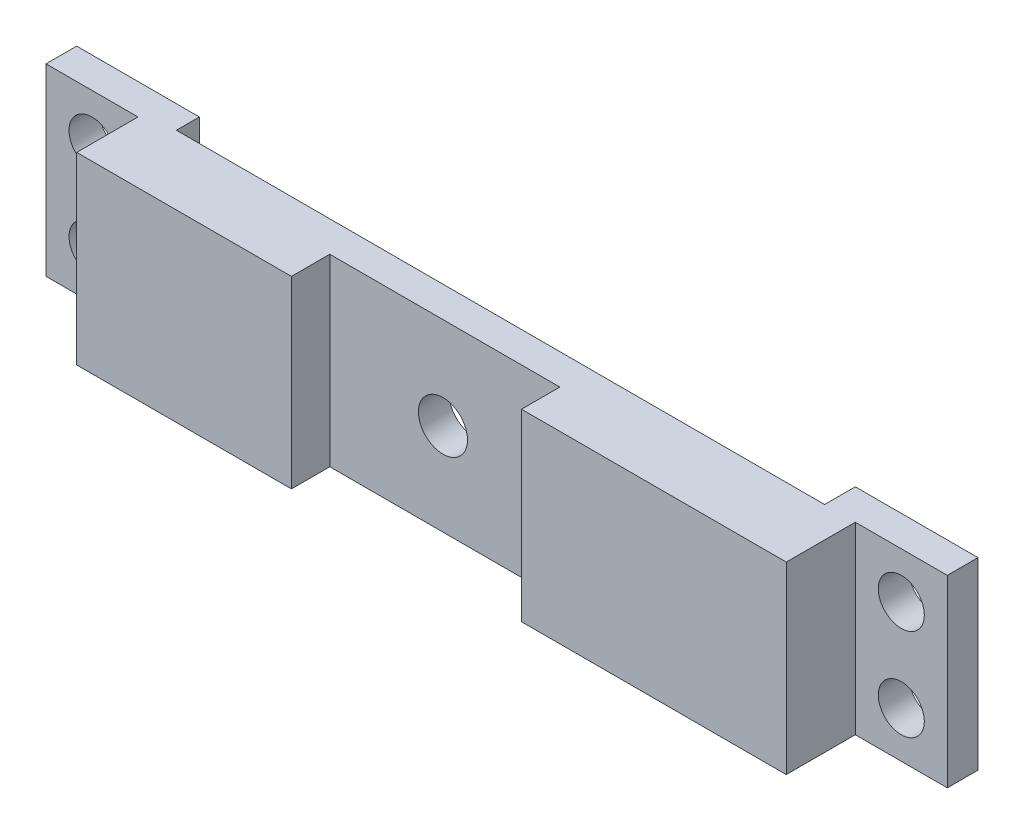
ISO-10303-21;
HEADER;
FILE_DESCRIPTION(('STEP AP214'),'2;1');
FILE_NAME('part.step','',(''),(''),'','','');
FILE_SCHEMA(('AUTOMOTIVE_DESIGN { 1 0 10303 214 1 1 1 1 }'));
ENDSEC;
DATA;
#1=APPLICATION_CONTEXT('core data for automotive mechanical design processes');
#2=APPLICATION_PROTOCOL_DEFINITION('international standard','automotive_design',2000,#1);
#3=PRODUCT_CONTEXT('',#1,'mechanical');
#4=PRODUCT('Part','Part','',(#3));
#5=PRODUCT_RELATED_PRODUCT_CATEGORY('part','',(#4));
#6=PRODUCT_DEFINITION_FORMATION('','',#4);
#7=PRODUCT_DEFINITION_CONTEXT('part definition',#1,'design');
#8=PRODUCT_DEFINITION('design','',#6,#7);
#9=PRODUCT_DEFINITION_SHAPE('','',#8);
#10=(LENGTH_UNIT() NAMED_UNIT(*) SI_UNIT(.MILLI.,.METRE.));
#11=(NAMED_UNIT(*) PLANE_ANGLE_UNIT() SI_UNIT($,.RADIAN.));
#12=(NAMED_UNIT(*) SI_UNIT($,.STERADIAN.) SOLID_ANGLE_UNIT());
#13=UNCERTAINTY_MEASURE_WITH_UNIT(LENGTH_MEASURE(1.E-05),#10,'distance_accuracy_value','');
#14=(GEOMETRIC_REPRESENTATION_CONTEXT(3) GLOBAL_UNCERTAINTY_ASSIGNED_CONTEXT((#13)) GLOBAL_UNIT_ASSIGNED_CONTEXT((#10,
#11,#12)) REPRESENTATION_CONTEXT('',''));
#15=CARTESIAN_POINT('',(0.,0.,0.));
#16=DIRECTION('',(0.,0.,1.));
#17=DIRECTION('',(1.,0.,0.));
#18=AXIS2_PLACEMENT_3D('',#15,#16,#17);
#19=CARTESIAN_POINT('',(9.88,0.,-4.52548339959391));
#20=DIRECTION('',(0.,0.,1.));
#21=DIRECTION('',(1.,0.,0.));
#22=AXIS2_PLACEMENT_3D('',#19,#20,#21);
#23=CYLINDRICAL_SURFACE('',#22,1.6);
#24=CARTESIAN_POINT('',(9.88,0.,3.5));
#25=DIRECTION('',(0.,0.,-1.));
#26=DIRECTION('',(-1.,0.,0.));
#27=AXIS2_PLACEMENT_3D('',#24,#25,#26);
#28=CIRCLE('',#27,1.6);
#29=CARTESIAN_POINT('',(8.27999999999999,0.,3.5));
#30=VERTEX_POINT('',#29);
#31=EDGE_CURVE('E322',#30,#30,#28,.F.);
#32=ORIENTED_EDGE('',*,*,#31,.T.);
#33=EDGE_LOOP('',(#32));
#34=FACE_BOUND('',#33,.T.);
#35=CARTESIAN_POINT('',(9.88,0.,1.5));
#36=DIRECTION('',(0.,0.,-1.));
#37=DIRECTION('',(-1.,0.,0.));
#38=AXIS2_PLACEMENT_3D('',#35,#36,#37);
#39=CIRCLE('',#38,1.6);
#40=CARTESIAN_POINT('',(8.27999999999999,0.,1.5));
#41=VERTEX_POINT('',#40);
#42=EDGE_CURVE('E184',#41,#41,#39,.F.);
#43=ORIENTED_EDGE('',*,*,#42,.F.);
#44=EDGE_LOOP('',(#43));
#45=FACE_BOUND('',#44,.T.);
#46=ADVANCED_FACE('F32',(#34,#45),#23,.F.);
#47=CARTESIAN_POINT('',(-17.5,6.,6.));
#48=DIRECTION('',(1.,0.,0.));
#49=DIRECTION('',(0.,1.,0.));
#50=AXIS2_PLACEMENT_3D('',#47,#48,#49);
#51=PLANE('',#50);
#52=DIRECTION('',(0.,-1.,0.));
#53=VECTOR('',#52,1.);
#54=CARTESIAN_POINT('',(-17.5,6.,2.));
#55=LINE('',#54,#53);
#56=CARTESIAN_POINT('',(-17.5,6.,2.));
#57=VERTEX_POINT('',#56);
#58=CARTESIAN_POINT('',(-17.5,-6.,2.));
#59=VERTEX_POINT('',#58);
#60=EDGE_CURVE('E341',#57,#59,#55,.T.);
#61=ORIENTED_EDGE('',*,*,#60,.F.);
#62=DIRECTION('',(0.,0.,-1.));
#63=VECTOR('',#62,1.);
#64=CARTESIAN_POINT('',(-17.5,6.,6.));
#65=LINE('',#64,#63);
#66=CARTESIAN_POINT('',(-17.5,6.,0.));
#67=VERTEX_POINT('',#66);
#68=EDGE_CURVE('E41',#57,#67,#65,.T.);
#69=ORIENTED_EDGE('',*,*,#68,.T.);
#70=DIRECTION('',(0.,-1.,0.));
#71=VECTOR('',#70,1.);
#72=CARTESIAN_POINT('',(-17.5,6.,0.));
#73=LINE('',#72,#71);
#74=CARTESIAN_POINT('',(-17.5,-6.,0.));
#75=VERTEX_POINT('',#74);
#76=EDGE_CURVE('E317',#67,#75,#73,.T.);
#77=ORIENTED_EDGE('',*,*,#76,.T.);
#78=DIRECTION('',(0.,0.,-1.));
#79=VECTOR('',#78,1.);
#80=CARTESIAN_POINT('',(-17.5,-6.,6.));
#81=LINE('',#80,#79);
#82=EDGE_CURVE('E11',#59,#75,#81,.T.);
#83=ORIENTED_EDGE('',*,*,#82,.F.);
#84=EDGE_LOOP('',(#61,#69,#77,#83));
#85=FACE_BOUND('',#84,.T.);
#86=ADVANCED_FACE('F34',(#85),#51,.F.);
#87=CARTESIAN_POINT('',(-17.5,-6.,6.));
#88=DIRECTION('',(0.,1.,0.));
#89=DIRECTION('',(0.,0.,1.));
#90=AXIS2_PLACEMENT_3D('',#87,#88,#89);
#91=PLANE('',#90);
#92=DIRECTION('',(1.,0.,0.));
#93=VECTOR('',#92,1.);
#94=CARTESIAN_POINT('',(-17.5,-6.,0.));
#95=LINE('',#94,#93);
#96=CARTESIAN_POINT('',(-9.5,-6.,0.));
#97=VERTEX_POINT('',#96);
#98=EDGE_CURVE('E320',#75,#97,#95,.T.);
#99=ORIENTED_EDGE('',*,*,#98,.T.);
#100=DIRECTION('',(0.,0.,-1.));
#101=VECTOR('',#100,1.);
#102=CARTESIAN_POINT('',(-9.5,-6.,1.5));
#103=LINE('',#102,#101);
#104=CARTESIAN_POINT('',(-9.5,-6.,1.5));
#105=VERTEX_POINT('',#104);
#106=EDGE_CURVE('E49',#105,#97,#103,.T.);
#107=ORIENTED_EDGE('',*,*,#106,.F.);
#108=DIRECTION('',(-1.,0.,0.));
#109=VECTOR('',#108,1.);
#110=CARTESIAN_POINT('',(17.5,-6.,1.5));
#111=LINE('',#110,#109);
#112=CARTESIAN_POINT('',(32.76,-6.,1.5));
#113=VERTEX_POINT('',#112);
#114=EDGE_CURVE('E177',#113,#105,#111,.T.);
#115=ORIENTED_EDGE('',*,*,#114,.F.);
#116=DIRECTION('',(0.,0.,-1.));
#117=VECTOR('',#116,1.);
#118=CARTESIAN_POINT('',(32.76,-6.,1.5));
#119=LINE('',#118,#117);
#120=CARTESIAN_POINT('',(32.76,-6.,-0.5));
#121=VERTEX_POINT('',#120);
#122=EDGE_CURVE('E153',#113,#121,#119,.T.);
#123=ORIENTED_EDGE('',*,*,#122,.T.);
#124=DIRECTION('',(1.,0.,0.));
#125=VECTOR('',#124,1.);
#126=CARTESIAN_POINT('',(32.76,-6.,-0.5));
#127=LINE('',#126,#125);
#128=CARTESIAN_POINT('',(40.76,-6.,-0.5));
#129=VERTEX_POINT('',#128);
#130=EDGE_CURVE('E269',#121,#129,#127,.T.);
#131=ORIENTED_EDGE('',*,*,#130,.T.);
#132=DIRECTION('',(0.,0.,1.));
#133=VECTOR('',#132,1.);
#134=CARTESIAN_POINT('',(40.76,-6.,1.5));
#135=LINE('',#134,#133);
#136=CARTESIAN_POINT('',(40.76,-6.,1.5));
#137=VERTEX_POINT('',#136);
#138=EDGE_CURVE('E263',#129,#137,#135,.T.);
#139=ORIENTED_EDGE('',*,*,#138,.T.);
#140=DIRECTION('',(-1.,0.,0.));
#141=VECTOR('',#140,1.);
#142=CARTESIAN_POINT('',(32.76,-6.,1.5));
#143=LINE('',#142,#141);
#144=CARTESIAN_POINT('',(34.76,-6.,1.5));
#145=VERTEX_POINT('',#144);
#146=EDGE_CURVE('E229',#137,#145,#143,.T.);
#147=ORIENTED_EDGE('',*,*,#146,.T.);
#148=DIRECTION('',(0.,0.,-1.));
#149=VECTOR('',#148,1.);
#150=CARTESIAN_POINT('',(34.76,-6.00000000000001,6.));
#151=LINE('',#150,#149);
#152=CARTESIAN_POINT('',(34.76,-6.00000000000001,6.));
#153=VERTEX_POINT('',#152);
#154=EDGE_CURVE('E249',#153,#145,#151,.T.);
#155=ORIENTED_EDGE('',*,*,#154,.F.);
#156=DIRECTION('',(-1.,0.,0.));
#157=VECTOR('',#156,1.);
#158=CARTESIAN_POINT('',(34.76,-6.00000000000001,6.));
#159=LINE('',#158,#157);
#160=CARTESIAN_POINT('',(17.5,-6.,6.));
#161=VERTEX_POINT('',#160);
#162=EDGE_CURVE('E183',#153,#161,#159,.T.);
#163=ORIENTED_EDGE('',*,*,#162,.T.);
#164=DIRECTION('',(0.,0.,-1.));
#165=VECTOR('',#164,1.);
#166=CARTESIAN_POINT('',(17.5,-6.,6.));
#167=LINE('',#166,#165);
#168=CARTESIAN_POINT('',(17.5,-6.,3.5));
#169=VERTEX_POINT('',#168);
#170=EDGE_CURVE('E219',#161,#169,#167,.T.);
#171=ORIENTED_EDGE('',*,*,#170,.T.);
#172=DIRECTION('',(1.,0.,0.));
#173=VECTOR('',#172,1.);
#174=CARTESIAN_POINT('',(17.5,-6.,3.5));
#175=LINE('',#174,#173);
#176=CARTESIAN_POINT('',(2.5,-6.,3.5));
#177=VERTEX_POINT('',#176);
#178=EDGE_CURVE('E201',#177,#169,#175,.T.);
#179=ORIENTED_EDGE('',*,*,#178,.F.);
#180=DIRECTION('',(0.,0.,1.));
#181=VECTOR('',#180,1.);
#182=CARTESIAN_POINT('',(2.5,-6.,3.5));
#183=LINE('',#182,#181);
#184=CARTESIAN_POINT('',(2.5,-6.,6.));
#185=VERTEX_POINT('',#184);
#186=EDGE_CURVE('E206',#177,#185,#183,.T.);
#187=ORIENTED_EDGE('',*,*,#186,.T.);
#188=DIRECTION('',(1.,0.,0.));
#189=VECTOR('',#188,1.);
#190=CARTESIAN_POINT('',(-17.5,-6.,6.));
#191=LINE('',#190,#189);
#192=CARTESIAN_POINT('',(-11.5,-6.,6.));
#193=VERTEX_POINT('',#192);
#194=EDGE_CURVE('E309',#193,#185,#191,.T.);
#195=ORIENTED_EDGE('',*,*,#194,.F.);
#196=DIRECTION('',(0.,0.,1.));
#197=VECTOR('',#196,1.);
#198=CARTESIAN_POINT('',(-11.5,-6.,2.));
#199=LINE('',#198,#197);
#200=CARTESIAN_POINT('',(-11.5,-6.,2.));
#201=VERTEX_POINT('',#200);
#202=EDGE_CURVE('E351',#201,#193,#199,.T.);
#203=ORIENTED_EDGE('',*,*,#202,.F.);
#204=DIRECTION('',(1.,0.,0.));
#205=VECTOR('',#204,1.);
#206=CARTESIAN_POINT('',(-17.5,-6.,2.));
#207=LINE('',#206,#205);
#208=EDGE_CURVE('E343',#59,#201,#207,.T.);
#209=ORIENTED_EDGE('',*,*,#208,.F.);
#210=ORIENTED_EDGE('',*,*,#82,.T.);
#211=EDGE_LOOP('',(#99,#107,#115,#123,#131,#139,#147,#155,#163,#171,#179,#187,#195,#203,#209,#210));
#212=FACE_BOUND('',#211,.T.);
#213=ADVANCED_FACE('F215',(#212),#91,.F.);
#214=CARTESIAN_POINT('',(-17.5,6.,6.));
#215=DIRECTION('',(0.,-1.,0.));
#216=DIRECTION('',(0.,0.,-1.));
#217=AXIS2_PLACEMENT_3D('',#214,#215,#216);
#218=PLANE('',#217);
#219=DIRECTION('',(1.,0.,0.));
#220=VECTOR('',#219,1.);
#221=CARTESIAN_POINT('',(17.5,6.,1.5));
#222=LINE('',#221,#220);
#223=CARTESIAN_POINT('',(-9.5,6.,1.5));
#224=VERTEX_POINT('',#223);
#225=CARTESIAN_POINT('',(32.76,6.,1.5));
#226=VERTEX_POINT('',#225);
#227=EDGE_CURVE('E164',#224,#226,#222,.T.);
#228=ORIENTED_EDGE('',*,*,#227,.F.);
#229=DIRECTION('',(0.,0.,-1.));
#230=VECTOR('',#229,1.);
#231=CARTESIAN_POINT('',(-9.5,6.,1.5));
#232=LINE('',#231,#230);
#233=CARTESIAN_POINT('',(-9.5,6.,0.));
#234=VERTEX_POINT('',#233);
#235=EDGE_CURVE('E175',#224,#234,#232,.T.);
#236=ORIENTED_EDGE('',*,*,#235,.T.);
#237=DIRECTION('',(-1.,0.,0.));
#238=VECTOR('',#237,1.);
#239=CARTESIAN_POINT('',(-17.5,6.,0.));
#240=LINE('',#239,#238);
#241=EDGE_CURVE('E313',#234,#67,#240,.T.);
#242=ORIENTED_EDGE('',*,*,#241,.T.);
#243=ORIENTED_EDGE('',*,*,#68,.F.);
#244=DIRECTION('',(-1.,0.,0.));
#245=VECTOR('',#244,1.);
#246=CARTESIAN_POINT('',(-17.5,6.,2.));
#247=LINE('',#246,#245);
#248=CARTESIAN_POINT('',(-11.5,6.,2.));
#249=VERTEX_POINT('',#248);
#250=EDGE_CURVE('E349',#249,#57,#247,.T.);
#251=ORIENTED_EDGE('',*,*,#250,.F.);
#252=DIRECTION('',(0.,0.,1.));
#253=VECTOR('',#252,1.);
#254=CARTESIAN_POINT('',(-11.5,6.,2.));
#255=LINE('',#254,#253);
#256=CARTESIAN_POINT('',(-11.5,6.,6.));
#257=VERTEX_POINT('',#256);
#258=EDGE_CURVE('E305',#249,#257,#255,.T.);
#259=ORIENTED_EDGE('',*,*,#258,.T.);
#260=DIRECTION('',(-1.,0.,0.));
#261=VECTOR('',#260,1.);
#262=CARTESIAN_POINT('',(-17.5,6.,6.));
#263=LINE('',#262,#261);
#264=CARTESIAN_POINT('',(2.5,6.,6.));
#265=VERTEX_POINT('',#264);
#266=EDGE_CURVE('E303',#265,#257,#263,.T.);
#267=ORIENTED_EDGE('',*,*,#266,.F.);
#268=DIRECTION('',(0.,0.,1.));
#269=VECTOR('',#268,1.);
#270=CARTESIAN_POINT('',(2.5,6.,3.5));
#271=LINE('',#270,#269);
#272=CARTESIAN_POINT('',(2.5,6.,3.5));
#273=VERTEX_POINT('',#272);
#274=EDGE_CURVE('E57',#273,#265,#271,.T.);
#275=ORIENTED_EDGE('',*,*,#274,.F.);
#276=DIRECTION('',(-1.,0.,0.));
#277=VECTOR('',#276,1.);
#278=CARTESIAN_POINT('',(17.5,6.,3.5));
#279=LINE('',#278,#277);
#280=CARTESIAN_POINT('',(17.5,6.,3.5));
#281=VERTEX_POINT('',#280);
#282=EDGE_CURVE('E195',#281,#273,#279,.T.);
#283=ORIENTED_EDGE('',*,*,#282,.F.);
#284=DIRECTION('',(0.,0.,1.));
#285=VECTOR('',#284,1.);
#286=CARTESIAN_POINT('',(17.5,6.,6.));
#287=LINE('',#286,#285);
#288=CARTESIAN_POINT('',(17.5,6.,6.));
#289=VERTEX_POINT('',#288);
#290=EDGE_CURVE('E224',#281,#289,#287,.T.);
#291=ORIENTED_EDGE('',*,*,#290,.T.);
#292=DIRECTION('',(-1.,0.,0.));
#293=VECTOR('',#292,1.);
#294=CARTESIAN_POINT('',(34.76,5.99999999999999,6.));
#295=LINE('',#294,#293);
#296=CARTESIAN_POINT('',(34.76,5.99999999999999,6.));
#297=VERTEX_POINT('',#296);
#298=EDGE_CURVE('E238',#297,#289,#295,.T.);
#299=ORIENTED_EDGE('',*,*,#298,.F.);
#300=DIRECTION('',(0.,0.,1.));
#301=VECTOR('',#300,1.);
#302=CARTESIAN_POINT('',(34.76,5.99999999999999,6.));
#303=LINE('',#302,#301);
#304=CARTESIAN_POINT('',(34.76,5.99999999999999,1.5));
#305=VERTEX_POINT('',#304);
#306=EDGE_CURVE('E240',#305,#297,#303,.T.);
#307=ORIENTED_EDGE('',*,*,#306,.F.);
#308=DIRECTION('',(1.,0.,0.));
#309=VECTOR('',#308,1.);
#310=CARTESIAN_POINT('',(32.76,6.,1.5));
#311=LINE('',#310,#309);
#312=CARTESIAN_POINT('',(40.76,6.,1.5));
#313=VERTEX_POINT('',#312);
#314=EDGE_CURVE('E167',#305,#313,#311,.T.);
#315=ORIENTED_EDGE('',*,*,#314,.T.);
#316=DIRECTION('',(0.,0.,-1.));
#317=VECTOR('',#316,1.);
#318=CARTESIAN_POINT('',(40.76,6.,1.5));
#319=LINE('',#318,#317);
#320=CARTESIAN_POINT('',(40.76,6.,-0.5));
#321=VERTEX_POINT('',#320);
#322=EDGE_CURVE('E265',#313,#321,#319,.T.);
#323=ORIENTED_EDGE('',*,*,#322,.T.);
#324=DIRECTION('',(-1.,0.,0.));
#325=VECTOR('',#324,1.);
#326=CARTESIAN_POINT('',(32.76,6.,-0.5));
#327=LINE('',#326,#325);
#328=CARTESIAN_POINT('',(32.76,6.,-0.5));
#329=VERTEX_POINT('',#328);
#330=EDGE_CURVE('E158',#321,#329,#327,.T.);
#331=ORIENTED_EDGE('',*,*,#330,.T.);
#332=DIRECTION('',(0.,0.,1.));
#333=VECTOR('',#332,1.);
#334=CARTESIAN_POINT('',(32.76,6.,1.5));
#335=LINE('',#334,#333);
#336=EDGE_CURVE('E151',#329,#226,#335,.T.);
#337=ORIENTED_EDGE('',*,*,#336,.T.);
#338=EDGE_LOOP('',(#228,#236,#242,#243,#251,#259,#267,#275,#283,#291,#299,#307,#315,#323,#331,#337));
#339=FACE_BOUND('',#338,.T.);
#340=ADVANCED_FACE('F162',(#339),#218,.F.);
#341=CARTESIAN_POINT('',(-17.5,-6.,6.));
#342=DIRECTION('',(0.,0.,1.));
#343=DIRECTION('',(1.,0.,0.));
#344=AXIS2_PLACEMENT_3D('',#341,#342,#343);
#345=PLANE('',#344);
#346=DIRECTION('',(0.,-1.,0.));
#347=VECTOR('',#346,1.);
#348=CARTESIAN_POINT('',(2.5,6.,6.));
#349=LINE('',#348,#347);
#350=EDGE_CURVE('E196',#265,#185,#349,.T.);
#351=ORIENTED_EDGE('',*,*,#350,.F.);
#352=ORIENTED_EDGE('',*,*,#266,.T.);
#353=DIRECTION('',(0.,1.,0.));
#354=VECTOR('',#353,1.);
#355=CARTESIAN_POINT('',(-11.5,6.,6.));
#356=LINE('',#355,#354);
#357=EDGE_CURVE('E340',#193,#257,#356,.T.);
#358=ORIENTED_EDGE('',*,*,#357,.F.);
#359=ORIENTED_EDGE('',*,*,#194,.T.);
#360=EDGE_LOOP('',(#351,#352,#358,#359));
#361=FACE_BOUND('',#360,.T.);
#362=ADVANCED_FACE('F357',(#361),#345,.T.);
#363=CARTESIAN_POINT('',(-17.5,-6.,0.));
#364=DIRECTION('',(0.,0.,1.));
#365=DIRECTION('',(1.,0.,0.));
#366=AXIS2_PLACEMENT_3D('',#363,#364,#365);
#367=PLANE('',#366);
#368=CARTESIAN_POINT('',(-14.5,-3.,0.));
#369=DIRECTION('',(0.,0.,1.));
#370=DIRECTION('',(1.,0.,0.));
#371=AXIS2_PLACEMENT_3D('',#368,#369,#370);
#372=CIRCLE('',#371,1.5);
#373=CARTESIAN_POINT('',(-13.,-3.,0.));
#374=VERTEX_POINT('',#373);
#375=EDGE_CURVE('E328',#374,#374,#372,.F.);
#376=ORIENTED_EDGE('',*,*,#375,.F.);
#377=EDGE_LOOP('',(#376));
#378=FACE_BOUND('',#377,.T.);
#379=CARTESIAN_POINT('',(-14.5,3.,0.));
#380=DIRECTION('',(0.,0.,1.));
#381=DIRECTION('',(1.,0.,0.));
#382=AXIS2_PLACEMENT_3D('',#379,#380,#381);
#383=CIRCLE('',#382,1.5);
#384=CARTESIAN_POINT('',(-13.,3.,0.));
#385=VERTEX_POINT('',#384);
#386=EDGE_CURVE('E337',#385,#385,#383,.F.);
#387=ORIENTED_EDGE('',*,*,#386,.F.);
#388=EDGE_LOOP('',(#387));
#389=FACE_BOUND('',#388,.T.);
#390=ORIENTED_EDGE('',*,*,#241,.F.);
#391=DIRECTION('',(0.,1.,0.));
#392=VECTOR('',#391,1.);
#393=CARTESIAN_POINT('',(-9.5,6.,0.));
#394=LINE('',#393,#392);
#395=EDGE_CURVE('E181',#97,#234,#394,.T.);
#396=ORIENTED_EDGE('',*,*,#395,.F.);
#397=ORIENTED_EDGE('',*,*,#98,.F.);
#398=ORIENTED_EDGE('',*,*,#76,.F.);
#399=EDGE_LOOP('',(#390,#396,#397,#398));
#400=FACE_BOUND('',#399,.T.);
#401=ADVANCED_FACE('F385',(#378,#389,#400),#367,.F.);
#402=CARTESIAN_POINT('',(-11.5,6.,2.));
#403=DIRECTION('',(1.,0.,0.));
#404=DIRECTION('',(0.,1.,0.));
#405=AXIS2_PLACEMENT_3D('',#402,#403,#404);
#406=PLANE('',#405);
#407=ORIENTED_EDGE('',*,*,#357,.T.);
#408=ORIENTED_EDGE('',*,*,#258,.F.);
#409=DIRECTION('',(0.,1.,0.));
#410=VECTOR('',#409,1.);
#411=CARTESIAN_POINT('',(-11.5,6.,2.));
#412=LINE('',#411,#410);
#413=EDGE_CURVE('E346',#201,#249,#412,.T.);
#414=ORIENTED_EDGE('',*,*,#413,.F.);
#415=ORIENTED_EDGE('',*,*,#202,.T.);
#416=EDGE_LOOP('',(#407,#408,#414,#415));
#417=FACE_BOUND('',#416,.T.);
#418=ADVANCED_FACE('F355',(#417),#406,.F.);
#419=CARTESIAN_POINT('',(-17.5,-6.,2.));
#420=DIRECTION('',(0.,0.,1.));
#421=DIRECTION('',(1.,0.,0.));
#422=AXIS2_PLACEMENT_3D('',#419,#420,#421);
#423=PLANE('',#422);
#424=CARTESIAN_POINT('',(-14.5,-3.,2.));
#425=DIRECTION('',(0.,0.,1.));
#426=DIRECTION('',(1.,0.,0.));
#427=AXIS2_PLACEMENT_3D('',#424,#425,#426);
#428=CIRCLE('',#427,1.5);
#429=CARTESIAN_POINT('',(-13.,-3.,2.));
#430=VERTEX_POINT('',#429);
#431=EDGE_CURVE('E324',#430,#430,#428,.T.);
#432=ORIENTED_EDGE('',*,*,#431,.F.);
#433=EDGE_LOOP('',(#432));
#434=FACE_BOUND('',#433,.T.);
#435=CARTESIAN_POINT('',(-14.5,3.,2.));
#436=DIRECTION('',(0.,0.,1.));
#437=DIRECTION('',(1.,0.,0.));
#438=AXIS2_PLACEMENT_3D('',#435,#436,#437);
#439=CIRCLE('',#438,1.5);
#440=CARTESIAN_POINT('',(-13.,3.,2.));
#441=VERTEX_POINT('',#440);
#442=EDGE_CURVE('E334',#441,#441,#439,.T.);
#443=ORIENTED_EDGE('',*,*,#442,.F.);
#444=EDGE_LOOP('',(#443));
#445=FACE_BOUND('',#444,.T.);
#446=ORIENTED_EDGE('',*,*,#60,.T.);
#447=ORIENTED_EDGE('',*,*,#208,.T.);
#448=ORIENTED_EDGE('',*,*,#413,.T.);
#449=ORIENTED_EDGE('',*,*,#250,.T.);
#450=EDGE_LOOP('',(#446,#447,#448,#449));
#451=FACE_BOUND('',#450,.T.);
#452=ADVANCED_FACE('F378',(#434,#445,#451),#423,.T.);
#453=CARTESIAN_POINT('',(-14.5,3.,-4.24264068711929));
#454=DIRECTION('',(0.,0.,1.));
#455=DIRECTION('',(1.,0.,0.));
#456=AXIS2_PLACEMENT_3D('',#453,#454,#455);
#457=CYLINDRICAL_SURFACE('',#456,1.5);
#458=ORIENTED_EDGE('',*,*,#386,.T.);
#459=EDGE_LOOP('',(#458));
#460=FACE_BOUND('',#459,.T.);
#461=ORIENTED_EDGE('',*,*,#442,.T.);
#462=EDGE_LOOP('',(#461));
#463=FACE_BOUND('',#462,.T.);
#464=ADVANCED_FACE('F374',(#460,#463),#457,.F.);
#465=CARTESIAN_POINT('',(-14.5,-3.,-4.24264068711929));
#466=DIRECTION('',(0.,0.,1.));
#467=DIRECTION('',(1.,0.,0.));
#468=AXIS2_PLACEMENT_3D('',#465,#466,#467);
#469=CYLINDRICAL_SURFACE('',#468,1.5);
#470=ORIENTED_EDGE('',*,*,#375,.T.);
#471=EDGE_LOOP('',(#470));
#472=FACE_BOUND('',#471,.T.);
#473=ORIENTED_EDGE('',*,*,#431,.T.);
#474=EDGE_LOOP('',(#473));
#475=FACE_BOUND('',#474,.T.);
#476=ADVANCED_FACE('F371',(#472,#475),#469,.F.);
#477=CARTESIAN_POINT('',(17.5,-6.,3.5));
#478=DIRECTION('',(0.,0.,-1.));
#479=DIRECTION('',(-1.,0.,0.));
#480=AXIS2_PLACEMENT_3D('',#477,#478,#479);
#481=PLANE('',#480);
#482=DIRECTION('',(0.,1.,0.));
#483=VECTOR('',#482,1.);
#484=CARTESIAN_POINT('',(17.5,6.,3.5));
#485=LINE('',#484,#483);
#486=EDGE_CURVE('E191',#169,#281,#485,.T.);
#487=ORIENTED_EDGE('',*,*,#486,.T.);
#488=ORIENTED_EDGE('',*,*,#282,.T.);
#489=DIRECTION('',(0.,-1.,0.));
#490=VECTOR('',#489,1.);
#491=CARTESIAN_POINT('',(2.5,6.,3.5));
#492=LINE('',#491,#490);
#493=EDGE_CURVE('E188',#273,#177,#492,.T.);
#494=ORIENTED_EDGE('',*,*,#493,.T.);
#495=ORIENTED_EDGE('',*,*,#178,.T.);
#496=EDGE_LOOP('',(#487,#488,#494,#495));
#497=FACE_BOUND('',#496,.T.);
#498=ORIENTED_EDGE('',*,*,#31,.F.);
#499=EDGE_LOOP('',(#498));
#500=FACE_BOUND('',#499,.T.);
#501=ADVANCED_FACE('F208',(#497,#500),#481,.F.);
#502=CARTESIAN_POINT('',(2.5,6.,3.5));
#503=DIRECTION('',(-1.,0.,0.));
#504=DIRECTION('',(0.,-1.,0.));
#505=AXIS2_PLACEMENT_3D('',#502,#503,#504);
#506=PLANE('',#505);
#507=ORIENTED_EDGE('',*,*,#350,.T.);
#508=ORIENTED_EDGE('',*,*,#186,.F.);
#509=ORIENTED_EDGE('',*,*,#493,.F.);
#510=ORIENTED_EDGE('',*,*,#274,.T.);
#511=EDGE_LOOP('',(#507,#508,#509,#510));
#512=FACE_BOUND('',#511,.T.);
#513=ADVANCED_FACE('F369',(#512),#506,.F.);
#514=CARTESIAN_POINT('',(17.5,-6.,1.5));
#515=DIRECTION('',(0.,0.,-1.));
#516=DIRECTION('',(-1.,0.,0.));
#517=AXIS2_PLACEMENT_3D('',#514,#515,#516);
#518=PLANE('',#517);
#519=DIRECTION('',(0.,1.,0.));
#520=VECTOR('',#519,1.);
#521=CARTESIAN_POINT('',(32.76,-14.2462112512353,1.5));
#522=LINE('',#521,#520);
#523=EDGE_CURVE('E147',#113,#226,#522,.T.);
#524=ORIENTED_EDGE('',*,*,#523,.F.);
#525=ORIENTED_EDGE('',*,*,#114,.T.);
#526=DIRECTION('',(0.,1.,0.));
#527=VECTOR('',#526,1.);
#528=CARTESIAN_POINT('',(-9.5,6.,1.5));
#529=LINE('',#528,#527);
#530=EDGE_CURVE('E173',#105,#224,#529,.T.);
#531=ORIENTED_EDGE('',*,*,#530,.T.);
#532=ORIENTED_EDGE('',*,*,#227,.T.);
#533=EDGE_LOOP('',(#524,#525,#531,#532));
#534=FACE_BOUND('',#533,.T.);
#535=ORIENTED_EDGE('',*,*,#42,.T.);
#536=EDGE_LOOP('',(#535));
#537=FACE_BOUND('',#536,.T.);
#538=ADVANCED_FACE('F171',(#534,#537),#518,.T.);
#539=CARTESIAN_POINT('',(-9.5,6.,1.5));
#540=DIRECTION('',(-1.,0.,0.));
#541=DIRECTION('',(0.,-1.,0.));
#542=AXIS2_PLACEMENT_3D('',#539,#540,#541);
#543=PLANE('',#542);
#544=ORIENTED_EDGE('',*,*,#395,.T.);
#545=ORIENTED_EDGE('',*,*,#235,.F.);
#546=ORIENTED_EDGE('',*,*,#530,.F.);
#547=ORIENTED_EDGE('',*,*,#106,.T.);
#548=EDGE_LOOP('',(#544,#545,#546,#547));
#549=FACE_BOUND('',#548,.T.);
#550=ADVANCED_FACE('F444',(#549),#543,.F.);
#551=CARTESIAN_POINT('',(34.76,5.99999999999999,6.));
#552=DIRECTION('',(0.,0.,-1.));
#553=DIRECTION('',(-1.,0.,0.));
#554=AXIS2_PLACEMENT_3D('',#551,#552,#553);
#555=PLANE('',#554);
#556=DIRECTION('',(0.,-1.,0.));
#557=VECTOR('',#556,1.);
#558=CARTESIAN_POINT('',(17.5,6.,6.));
#559=LINE('',#558,#557);
#560=EDGE_CURVE('E225',#289,#161,#559,.T.);
#561=ORIENTED_EDGE('',*,*,#560,.T.);
#562=ORIENTED_EDGE('',*,*,#162,.F.);
#563=DIRECTION('',(0.,-1.,0.));
#564=VECTOR('',#563,1.);
#565=CARTESIAN_POINT('',(34.76,5.99999999999999,6.));
#566=LINE('',#565,#564);
#567=EDGE_CURVE('E227',#297,#153,#566,.T.);
#568=ORIENTED_EDGE('',*,*,#567,.F.);
#569=ORIENTED_EDGE('',*,*,#298,.T.);
#570=EDGE_LOOP('',(#561,#562,#568,#569));
#571=FACE_BOUND('',#570,.T.);
#572=ADVANCED_FACE('F299',(#571),#555,.F.);
#573=CARTESIAN_POINT('',(34.76,-6.00000000000001,6.));
#574=DIRECTION('',(1.,0.,0.));
#575=DIRECTION('',(0.,0.,-1.));
#576=AXIS2_PLACEMENT_3D('',#573,#574,#575);
#577=PLANE('',#576);
#578=ORIENTED_EDGE('',*,*,#567,.T.);
#579=ORIENTED_EDGE('',*,*,#154,.T.);
#580=DIRECTION('',(0.,1.,0.));
#581=VECTOR('',#580,1.);
#582=CARTESIAN_POINT('',(34.76,5.99999999999999,1.5));
#583=LINE('',#582,#581);
#584=EDGE_CURVE('E244',#145,#305,#583,.T.);
#585=ORIENTED_EDGE('',*,*,#584,.T.);
#586=ORIENTED_EDGE('',*,*,#306,.T.);
#587=EDGE_LOOP('',(#578,#579,#585,#586));
#588=FACE_BOUND('',#587,.T.);
#589=ADVANCED_FACE('F298',(#588),#577,.T.);
#590=CARTESIAN_POINT('',(17.5,-6.,6.));
#591=DIRECTION('',(1.,0.,0.));
#592=DIRECTION('',(0.,0.,-1.));
#593=AXIS2_PLACEMENT_3D('',#590,#591,#592);
#594=PLANE('',#593);
#595=ORIENTED_EDGE('',*,*,#486,.F.);
#596=ORIENTED_EDGE('',*,*,#170,.F.);
#597=ORIENTED_EDGE('',*,*,#560,.F.);
#598=ORIENTED_EDGE('',*,*,#290,.F.);
#599=EDGE_LOOP('',(#595,#596,#597,#598));
#600=FACE_BOUND('',#599,.T.);
#601=ADVANCED_FACE('F300',(#600),#594,.F.);
#602=CARTESIAN_POINT('',(32.76,-14.2462112512353,1.5));
#603=DIRECTION('',(-1.,0.,0.));
#604=DIRECTION('',(0.,0.,1.));
#605=AXIS2_PLACEMENT_3D('',#602,#603,#604);
#606=PLANE('',#605);
#607=ORIENTED_EDGE('',*,*,#122,.F.);
#608=ORIENTED_EDGE('',*,*,#523,.T.);
#609=ORIENTED_EDGE('',*,*,#336,.F.);
#610=DIRECTION('',(0.,1.,0.));
#611=VECTOR('',#610,1.);
#612=CARTESIAN_POINT('',(32.76,-14.2462112512353,-0.5));
#613=LINE('',#612,#611);
#614=EDGE_CURVE('E261',#121,#329,#613,.T.);
#615=ORIENTED_EDGE('',*,*,#614,.F.);
#616=EDGE_LOOP('',(#607,#608,#609,#615));
#617=FACE_BOUND('',#616,.T.);
#618=ADVANCED_FACE('F149',(#617),#606,.T.);
#619=CARTESIAN_POINT('',(32.76,-14.2462112512353,-0.5));
#620=DIRECTION('',(0.,0.,-1.));
#621=DIRECTION('',(-1.,0.,0.));
#622=AXIS2_PLACEMENT_3D('',#619,#620,#621);
#623=PLANE('',#622);
#624=CARTESIAN_POINT('',(37.76,-3.,-0.5));
#625=DIRECTION('',(0.,0.,-1.));
#626=DIRECTION('',(-1.,0.,0.));
#627=AXIS2_PLACEMENT_3D('',#624,#625,#626);
#628=CIRCLE('',#627,1.5);
#629=CARTESIAN_POINT('',(39.26,-3.,-0.5));
#630=VERTEX_POINT('',#629);
#631=EDGE_CURVE('E277',#630,#630,#628,.F.);
#632=ORIENTED_EDGE('',*,*,#631,.T.);
#633=EDGE_LOOP('',(#632));
#634=FACE_BOUND('',#633,.T.);
#635=CARTESIAN_POINT('',(37.76,2.99999999999999,-0.5));
#636=DIRECTION('',(0.,0.,-1.));
#637=DIRECTION('',(-1.,0.,0.));
#638=AXIS2_PLACEMENT_3D('',#635,#636,#637);
#639=CIRCLE('',#638,1.5);
#640=CARTESIAN_POINT('',(39.26,2.99999999999999,-0.5));
#641=VERTEX_POINT('',#640);
#642=EDGE_CURVE('E168',#641,#641,#639,.F.);
#643=ORIENTED_EDGE('',*,*,#642,.T.);
#644=EDGE_LOOP('',(#643));
#645=FACE_BOUND('',#644,.T.);
#646=ORIENTED_EDGE('',*,*,#130,.F.);
#647=ORIENTED_EDGE('',*,*,#614,.T.);
#648=ORIENTED_EDGE('',*,*,#330,.F.);
#649=DIRECTION('',(0.,1.,0.));
#650=VECTOR('',#649,1.);
#651=CARTESIAN_POINT('',(40.76,-14.2462112512353,-0.5));
#652=LINE('',#651,#650);
#653=EDGE_CURVE('E259',#129,#321,#652,.T.);
#654=ORIENTED_EDGE('',*,*,#653,.F.);
#655=EDGE_LOOP('',(#646,#647,#648,#654));
#656=FACE_BOUND('',#655,.T.);
#657=ADVANCED_FACE('F472',(#634,#645,#656),#623,.T.);
#658=CARTESIAN_POINT('',(40.76,-14.2462112512353,1.5));
#659=DIRECTION('',(1.,0.,0.));
#660=DIRECTION('',(0.,0.,-1.));
#661=AXIS2_PLACEMENT_3D('',#658,#659,#660);
#662=PLANE('',#661);
#663=ORIENTED_EDGE('',*,*,#138,.F.);
#664=ORIENTED_EDGE('',*,*,#653,.T.);
#665=ORIENTED_EDGE('',*,*,#322,.F.);
#666=DIRECTION('',(0.,1.,0.));
#667=VECTOR('',#666,1.);
#668=CARTESIAN_POINT('',(40.76,-14.2462112512353,1.5));
#669=LINE('',#668,#667);
#670=EDGE_CURVE('E157',#137,#313,#669,.T.);
#671=ORIENTED_EDGE('',*,*,#670,.F.);
#672=EDGE_LOOP('',(#663,#664,#665,#671));
#673=FACE_BOUND('',#672,.T.);
#674=ADVANCED_FACE('F291',(#673),#662,.T.);
#675=CARTESIAN_POINT('',(32.76,-14.2462112512353,1.5));
#676=DIRECTION('',(0.,0.,1.));
#677=DIRECTION('',(1.,0.,0.));
#678=AXIS2_PLACEMENT_3D('',#675,#676,#677);
#679=PLANE('',#678);
#680=CARTESIAN_POINT('',(37.76,-3.,1.5));
#681=DIRECTION('',(0.,0.,1.));
#682=DIRECTION('',(1.,0.,0.));
#683=AXIS2_PLACEMENT_3D('',#680,#681,#682);
#684=CIRCLE('',#683,1.5);
#685=CARTESIAN_POINT('',(39.26,-3.,1.5));
#686=VERTEX_POINT('',#685);
#687=EDGE_CURVE('E280',#686,#686,#684,.T.);
#688=ORIENTED_EDGE('',*,*,#687,.F.);
#689=EDGE_LOOP('',(#688));
#690=FACE_BOUND('',#689,.T.);
#691=CARTESIAN_POINT('',(37.76,2.99999999999999,1.5));
#692=DIRECTION('',(0.,0.,1.));
#693=DIRECTION('',(1.,0.,0.));
#694=AXIS2_PLACEMENT_3D('',#691,#692,#693);
#695=CIRCLE('',#694,1.5);
#696=CARTESIAN_POINT('',(39.26,2.99999999999999,1.5));
#697=VERTEX_POINT('',#696);
#698=EDGE_CURVE('E274',#697,#697,#695,.T.);
#699=ORIENTED_EDGE('',*,*,#698,.F.);
#700=EDGE_LOOP('',(#699));
#701=FACE_BOUND('',#700,.T.);
#702=ORIENTED_EDGE('',*,*,#314,.F.);
#703=ORIENTED_EDGE('',*,*,#584,.F.);
#704=ORIENTED_EDGE('',*,*,#146,.F.);
#705=ORIENTED_EDGE('',*,*,#670,.T.);
#706=EDGE_LOOP('',(#702,#703,#704,#705));
#707=FACE_BOUND('',#706,.T.);
#708=ADVANCED_FACE('F287',(#690,#701,#707),#679,.T.);
#709=CARTESIAN_POINT('',(37.76,2.99999999999999,-4.74264068711929));
#710=DIRECTION('',(0.,0.,1.));
#711=DIRECTION('',(1.,0.,0.));
#712=AXIS2_PLACEMENT_3D('',#709,#710,#711);
#713=CYLINDRICAL_SURFACE('',#712,1.5);
#714=CARTESIAN_POINT('',(39.26,2.99999999999999,1.5));
#715=CARTESIAN_POINT('',(39.26,2.99999999999999,1.47916666666667));
#716=CARTESIAN_POINT('',(39.26,2.99999999999999,1.45833333333333));
#717=CARTESIAN_POINT('',(39.26,2.99999999999999,1.41666666666667));
#718=CARTESIAN_POINT('',(39.26,2.99999999999999,1.39583333333333));
#719=CARTESIAN_POINT('',(39.26,2.99999999999999,1.35416666666667));
#720=CARTESIAN_POINT('',(39.26,2.99999999999999,1.33333333333333));
#721=CARTESIAN_POINT('',(39.26,2.99999999999999,1.29166666666667));
#722=CARTESIAN_POINT('',(39.26,2.99999999999999,1.27083333333333));
#723=CARTESIAN_POINT('',(39.26,2.99999999999999,1.22916666666667));
#724=CARTESIAN_POINT('',(39.26,2.99999999999999,1.20833333333333));
#725=CARTESIAN_POINT('',(39.26,2.99999999999999,1.16666666666667));
#726=CARTESIAN_POINT('',(39.26,2.99999999999999,1.14583333333333));
#727=CARTESIAN_POINT('',(39.26,2.99999999999999,1.10416666666667));
#728=CARTESIAN_POINT('',(39.26,2.99999999999999,1.08333333333333));
#729=CARTESIAN_POINT('',(39.26,2.99999999999999,1.04166666666667));
#730=CARTESIAN_POINT('',(39.26,2.99999999999999,1.02083333333333));
#731=CARTESIAN_POINT('',(39.26,2.99999999999999,0.979166666666667));
#732=CARTESIAN_POINT('',(39.26,2.99999999999999,0.958333333333333));
#733=CARTESIAN_POINT('',(39.26,2.99999999999999,0.916666666666667));
#734=CARTESIAN_POINT('',(39.26,2.99999999999999,0.895833333333334));
#735=CARTESIAN_POINT('',(39.26,2.99999999999999,0.854166666666667));
#736=CARTESIAN_POINT('',(39.26,2.99999999999999,0.833333333333334));
#737=CARTESIAN_POINT('',(39.26,2.99999999999999,0.791666666666667));
#738=CARTESIAN_POINT('',(39.26,2.99999999999999,0.770833333333334));
#739=CARTESIAN_POINT('',(39.26,2.99999999999999,0.729166666666667));
#740=CARTESIAN_POINT('',(39.26,2.99999999999999,0.708333333333334));
#741=CARTESIAN_POINT('',(39.26,2.99999999999999,0.666666666666667));
#742=CARTESIAN_POINT('',(39.26,2.99999999999999,0.645833333333334));
#743=CARTESIAN_POINT('',(39.26,2.99999999999999,0.604166666666667));
#744=CARTESIAN_POINT('',(39.26,2.99999999999999,0.583333333333334));
#745=CARTESIAN_POINT('',(39.26,2.99999999999999,0.541666666666667));
#746=CARTESIAN_POINT('',(39.26,2.99999999999999,0.520833333333334));
#747=CARTESIAN_POINT('',(39.26,2.99999999999999,0.479166666666667));
#748=CARTESIAN_POINT('',(39.26,2.99999999999999,0.458333333333334));
#749=CARTESIAN_POINT('',(39.26,2.99999999999999,0.416666666666667));
#750=CARTESIAN_POINT('',(39.26,2.99999999999999,0.395833333333334));
#751=CARTESIAN_POINT('',(39.26,2.99999999999999,0.354166666666667));
#752=CARTESIAN_POINT('',(39.26,2.99999999999999,0.333333333333334));
#753=CARTESIAN_POINT('',(39.26,2.99999999999999,0.291666666666667));
#754=CARTESIAN_POINT('',(39.26,2.99999999999999,0.270833333333334));
#755=CARTESIAN_POINT('',(39.26,2.99999999999999,0.229166666666667));
#756=CARTESIAN_POINT('',(39.26,2.99999999999999,0.208333333333334));
#757=CARTESIAN_POINT('',(39.26,2.99999999999999,0.166666666666667));
#758=CARTESIAN_POINT('',(39.26,2.99999999999999,0.145833333333334));
#759=CARTESIAN_POINT('',(39.26,2.99999999999999,0.104166666666668));
#760=CARTESIAN_POINT('',(39.26,2.99999999999999,0.0833333333333343));
#761=CARTESIAN_POINT('',(39.26,2.99999999999999,0.0416666666666676));
#762=CARTESIAN_POINT('',(39.26,2.99999999999999,0.0208333333333342));
#763=CARTESIAN_POINT('',(39.26,2.99999999999999,-0.0208333333333325));
#764=CARTESIAN_POINT('',(39.26,2.99999999999999,-0.0416666666666658));
#765=CARTESIAN_POINT('',(39.26,2.99999999999999,-0.0833333333333325));
#766=CARTESIAN_POINT('',(39.26,2.99999999999999,-0.104166666666666));
#767=CARTESIAN_POINT('',(39.26,2.99999999999999,-0.145833333333333));
#768=CARTESIAN_POINT('',(39.26,2.99999999999999,-0.166666666666666));
#769=CARTESIAN_POINT('',(39.26,2.99999999999999,-0.208333333333333));
#770=CARTESIAN_POINT('',(39.26,2.99999999999999,-0.229166666666666));
#771=CARTESIAN_POINT('',(39.26,2.99999999999999,-0.270833333333333));
#772=CARTESIAN_POINT('',(39.26,2.99999999999999,-0.291666666666666));
#773=CARTESIAN_POINT('',(39.26,2.99999999999999,-0.333333333333333));
#774=CARTESIAN_POINT('',(39.26,2.99999999999999,-0.354166666666666));
#775=CARTESIAN_POINT('',(39.26,2.99999999999999,-0.395833333333333));
#776=CARTESIAN_POINT('',(39.26,2.99999999999999,-0.416666666666666));
#777=CARTESIAN_POINT('',(39.26,2.99999999999999,-0.458333333333333));
#778=CARTESIAN_POINT('',(39.26,2.99999999999999,-0.479166666666666));
#779=CARTESIAN_POINT('',(39.26,2.99999999999999,-0.5));
#780=B_SPLINE_CURVE_WITH_KNOTS('',3,(#714,#715,#716,#717,#718,#719,#720,#721,#722,#723,#724,
#725,#726,#727,#728,#729,#730,#731,#732,#733,#734,#735,#736,#737,#738,#739,#740,#741,#742,#743,
#744,#745,#746,#747,#748,#749,#750,#751,#752,#753,#754,#755,#756,#757,#758,#759,#760,#761,#762,
#763,#764,#765,#766,#767,#768,#769,#770,#771,#772,#773,#774,#775,#776,#777,#778,#779),
.UNSPECIFIED.,.F.,.F.,(4,2,2,2,2,2,2,2,2,2,2,2,2,2,2,2,2,2,2,2,2,2,2,2,2,2,2,2,2,2,2,2,4),(0.,
0.0625000000000001,0.125,0.1875,0.25,0.3125,0.375,0.4375,0.5,0.5625,0.625,0.6875,0.75,0.8125,
0.875,0.9375,1.,1.0625,1.125,1.1875,1.25,1.3125,1.375,1.4375,1.5,1.5625,1.625,1.6875,1.75,
1.8125,1.875,1.9375,2.),.UNSPECIFIED.);
#781=EDGE_CURVE('BSEAM290',#697,#641,#780,.T.);
#782=ORIENTED_EDGE('',*,*,#698,.T.);
#783=ORIENTED_EDGE('',*,*,#642,.F.);
#784=ORIENTED_EDGE('',*,*,#781,.T.);
#785=ORIENTED_EDGE('',*,*,#781,.F.);
#786=EDGE_LOOP('',(#782,#784,#783,#785));
#787=FACE_BOUND('',#786,.T.);
#788=ADVANCED_FACE('F290',(#787),#713,.F.);
#789=CARTESIAN_POINT('',(37.76,-3.,-4.74264068711929));
#790=DIRECTION('',(0.,0.,1.));
#791=DIRECTION('',(1.,0.,0.));
#792=AXIS2_PLACEMENT_3D('',#789,#790,#791);
#793=CYLINDRICAL_SURFACE('',#792,1.5);
#794=CARTESIAN_POINT('',(39.26,-3.,1.5));
#795=CARTESIAN_POINT('',(39.26,-3.,1.47916666666667));
#796=CARTESIAN_POINT('',(39.26,-3.,1.45833333333333));
#797=CARTESIAN_POINT('',(39.26,-3.,1.41666666666667));
#798=CARTESIAN_POINT('',(39.26,-3.,1.39583333333333));
#799=CARTESIAN_POINT('',(39.26,-3.,1.35416666666667));
#800=CARTESIAN_POINT('',(39.26,-3.,1.33333333333333));
#801=CARTESIAN_POINT('',(39.26,-3.,1.29166666666667));
#802=CARTESIAN_POINT('',(39.26,-3.,1.27083333333333));
#803=CARTESIAN_POINT('',(39.26,-3.,1.22916666666667));
#804=CARTESIAN_POINT('',(39.26,-3.,1.20833333333333));
#805=CARTESIAN_POINT('',(39.26,-3.,1.16666666666667));
#806=CARTESIAN_POINT('',(39.26,-3.,1.14583333333333));
#807=CARTESIAN_POINT('',(39.26,-3.,1.10416666666667));
#808=CARTESIAN_POINT('',(39.26,-3.,1.08333333333333));
#809=CARTESIAN_POINT('',(39.26,-3.,1.04166666666667));
#810=CARTESIAN_POINT('',(39.26,-3.,1.02083333333333));
#811=CARTESIAN_POINT('',(39.26,-3.,0.979166666666667));
#812=CARTESIAN_POINT('',(39.26,-3.,0.958333333333333));
#813=CARTESIAN_POINT('',(39.26,-3.,0.916666666666667));
#814=CARTESIAN_POINT('',(39.26,-3.,0.895833333333334));
#815=CARTESIAN_POINT('',(39.26,-3.,0.854166666666667));
#816=CARTESIAN_POINT('',(39.26,-3.,0.833333333333334));
#817=CARTESIAN_POINT('',(39.26,-3.,0.791666666666667));
#818=CARTESIAN_POINT('',(39.26,-3.,0.770833333333334));
#819=CARTESIAN_POINT('',(39.26,-3.,0.729166666666667));
#820=CARTESIAN_POINT('',(39.26,-3.,0.708333333333334));
#821=CARTESIAN_POINT('',(39.26,-3.,0.666666666666667));
#822=CARTESIAN_POINT('',(39.26,-3.,0.645833333333334));
#823=CARTESIAN_POINT('',(39.26,-3.,0.604166666666667));
#824=CARTESIAN_POINT('',(39.26,-3.,0.583333333333334));
#825=CARTESIAN_POINT('',(39.26,-3.,0.541666666666667));
#826=CARTESIAN_POINT('',(39.26,-3.,0.520833333333334));
#827=CARTESIAN_POINT('',(39.26,-3.,0.479166666666667));
#828=CARTESIAN_POINT('',(39.26,-3.,0.458333333333334));
#829=CARTESIAN_POINT('',(39.26,-3.,0.416666666666667));
#830=CARTESIAN_POINT('',(39.26,-3.,0.395833333333334));
#831=CARTESIAN_POINT('',(39.26,-3.,0.354166666666667));
#832=CARTESIAN_POINT('',(39.26,-3.,0.333333333333334));
#833=CARTESIAN_POINT('',(39.26,-3.,0.291666666666667));
#834=CARTESIAN_POINT('',(39.26,-3.,0.270833333333334));
#835=CARTESIAN_POINT('',(39.26,-3.,0.229166666666667));
#836=CARTESIAN_POINT('',(39.26,-3.,0.208333333333334));
#837=CARTESIAN_POINT('',(39.26,-3.,0.166666666666667));
#838=CARTESIAN_POINT('',(39.26,-3.,0.145833333333334));
#839=CARTESIAN_POINT('',(39.26,-3.,0.104166666666668));
#840=CARTESIAN_POINT('',(39.26,-3.,0.0833333333333343));
#841=CARTESIAN_POINT('',(39.26,-3.,0.0416666666666676));
#842=CARTESIAN_POINT('',(39.26,-3.,0.0208333333333342));
#843=CARTESIAN_POINT('',(39.26,-3.,-0.0208333333333325));
#844=CARTESIAN_POINT('',(39.26,-3.,-0.0416666666666658));
#845=CARTESIAN_POINT('',(39.26,-3.,-0.0833333333333325));
#846=CARTESIAN_POINT('',(39.26,-3.,-0.104166666666666));
#847=CARTESIAN_POINT('',(39.26,-3.,-0.145833333333333));
#848=CARTESIAN_POINT('',(39.26,-3.,-0.166666666666666));
#849=CARTESIAN_POINT('',(39.26,-3.,-0.208333333333333));
#850=CARTESIAN_POINT('',(39.26,-3.,-0.229166666666666));
#851=CARTESIAN_POINT('',(39.26,-3.,-0.270833333333333));
#852=CARTESIAN_POINT('',(39.26,-3.,-0.291666666666666));
#853=CARTESIAN_POINT('',(39.26,-3.,-0.333333333333333));
#854=CARTESIAN_POINT('',(39.26,-3.,-0.354166666666666));
#855=CARTESIAN_POINT('',(39.26,-3.,-0.395833333333333));
#856=CARTESIAN_POINT('',(39.26,-3.,-0.416666666666666));
#857=CARTESIAN_POINT('',(39.26,-3.,-0.458333333333333));
#858=CARTESIAN_POINT('',(39.26,-3.,-0.479166666666666));
#859=CARTESIAN_POINT('',(39.26,-3.,-0.5));
#860=B_SPLINE_CURVE_WITH_KNOTS('',3,(#794,#795,#796,#797,#798,#799,#800,#801,#802,#803,#804,
#805,#806,#807,#808,#809,#810,#811,#812,#813,#814,#815,#816,#817,#818,#819,#820,#821,#822,#823,
#824,#825,#826,#827,#828,#829,#830,#831,#832,#833,#834,#835,#836,#837,#838,#839,#840,#841,#842,
#843,#844,#845,#846,#847,#848,#849,#850,#851,#852,#853,#854,#855,#856,#857,#858,#859),
.UNSPECIFIED.,.F.,.F.,(4,2,2,2,2,2,2,2,2,2,2,2,2,2,2,2,2,2,2,2,2,2,2,2,2,2,2,2,2,2,2,2,4),(0.,
0.0625000000000001,0.125,0.1875,0.25,0.3125,0.375,0.4375,0.5,0.5625,0.625,0.6875,0.75,0.8125,
0.875,0.9375,1.,1.0625,1.125,1.1875,1.25,1.3125,1.375,1.4375,1.5,1.5625,1.625,1.6875,1.75,
1.8125,1.875,1.9375,2.),.UNSPECIFIED.);
#861=EDGE_CURVE('BSEAM284',#686,#630,#860,.T.);
#862=ORIENTED_EDGE('',*,*,#687,.T.);
#863=ORIENTED_EDGE('',*,*,#631,.F.);
#864=ORIENTED_EDGE('',*,*,#861,.T.);
#865=ORIENTED_EDGE('',*,*,#861,.F.);
#866=EDGE_LOOP('',(#862,#864,#863,#865));
#867=FACE_BOUND('',#866,.T.);
#868=ADVANCED_FACE('F284',(#867),#793,.F.);
#869=CLOSED_SHELL('',(#46,#86,#213,#340,#362,#401,#418,#452,#464,#476,#501,#513,#538,#550,#572,
#589,#601,#618,#657,#674,#708,#788,#868));
#870=MANIFOLD_SOLID_BREP('B2',#869);
#871=ADVANCED_BREP_SHAPE_REPRESENTATION('',(#18,#870),#14);
#872=SHAPE_DEFINITION_REPRESENTATION(#9,#871);
ENDSEC;
END-ISO-10303-21;
